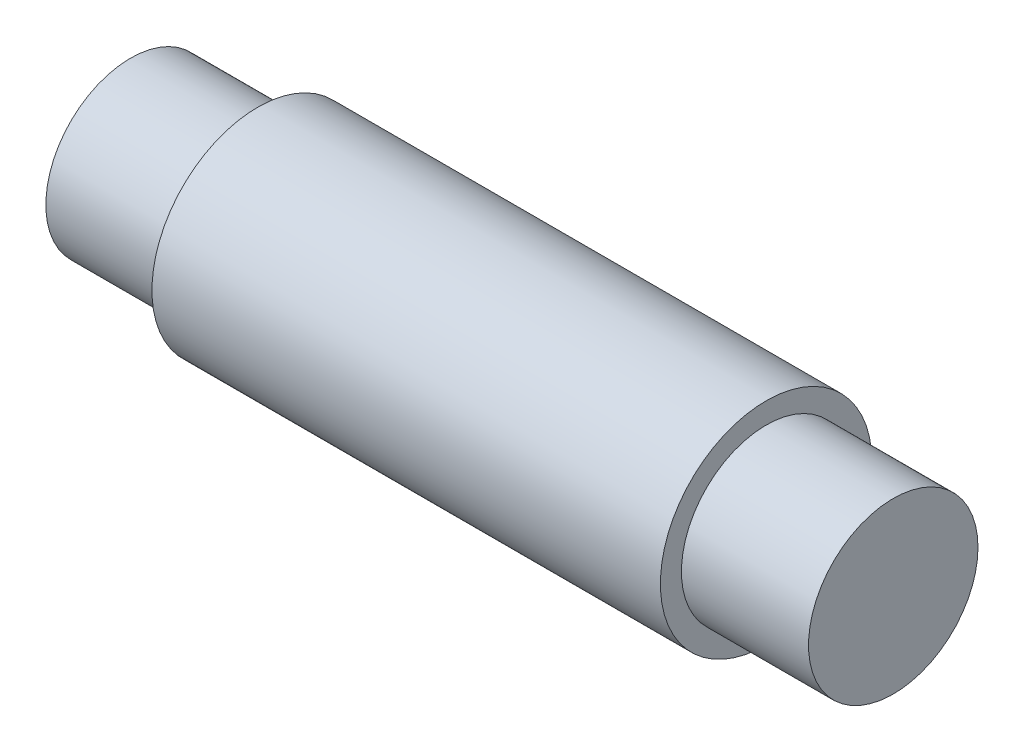
ISO-10303-21;
HEADER;
FILE_DESCRIPTION(('STEP AP214'),'2;1');
FILE_NAME('part.step','',(''),(''),'','','');
FILE_SCHEMA(('AUTOMOTIVE_DESIGN { 1 0 10303 214 1 1 1 1 }'));
ENDSEC;
DATA;
#1=APPLICATION_CONTEXT('core data for automotive mechanical design processes');
#2=APPLICATION_PROTOCOL_DEFINITION('international standard','automotive_design',2000,#1);
#3=PRODUCT_CONTEXT('',#1,'mechanical');
#4=PRODUCT('Part','Part','',(#3));
#5=PRODUCT_RELATED_PRODUCT_CATEGORY('part','',(#4));
#6=PRODUCT_DEFINITION_FORMATION('','',#4);
#7=PRODUCT_DEFINITION_CONTEXT('part definition',#1,'design');
#8=PRODUCT_DEFINITION('design','',#6,#7);
#9=PRODUCT_DEFINITION_SHAPE('','',#8);
#10=(LENGTH_UNIT() NAMED_UNIT(*) SI_UNIT(.MILLI.,.METRE.));
#11=(NAMED_UNIT(*) PLANE_ANGLE_UNIT() SI_UNIT($,.RADIAN.));
#12=(NAMED_UNIT(*) SI_UNIT($,.STERADIAN.) SOLID_ANGLE_UNIT());
#13=UNCERTAINTY_MEASURE_WITH_UNIT(LENGTH_MEASURE(1.E-05),#10,'distance_accuracy_value','');
#14=(GEOMETRIC_REPRESENTATION_CONTEXT(3) GLOBAL_UNCERTAINTY_ASSIGNED_CONTEXT((#13)) GLOBAL_UNIT_ASSIGNED_CONTEXT((#10,
#11,#12)) REPRESENTATION_CONTEXT('',''));
#15=CARTESIAN_POINT('',(0.,0.,0.));
#16=DIRECTION('',(0.,0.,1.));
#17=DIRECTION('',(1.,0.,0.));
#18=AXIS2_PLACEMENT_3D('',#15,#16,#17);
#19=CARTESIAN_POINT('',(-14.2875,0.,0.));
#20=DIRECTION('',(1.,0.,0.));
#21=DIRECTION('',(0.,0.,-1.));
#22=AXIS2_PLACEMENT_3D('',#19,#20,#21);
#23=PLANE('',#22);
#24=CARTESIAN_POINT('',(-14.2875,0.,0.));
#25=DIRECTION('',(1.,0.,0.));
#26=DIRECTION('',(0.,0.,-1.));
#27=AXIS2_PLACEMENT_3D('',#24,#25,#26);
#28=CIRCLE('',#27,3.17499999999999);
#29=CARTESIAN_POINT('',(-14.2875,0.,-3.17499999999999));
#30=VERTEX_POINT('',#29);
#31=EDGE_CURVE('E66',#30,#30,#28,.T.);
#32=ORIENTED_EDGE('',*,*,#31,.F.);
#33=EDGE_LOOP('',(#32));
#34=FACE_BOUND('',#33,.T.);
#35=ADVANCED_FACE('F39',(#34),#23,.F.);
#36=CARTESIAN_POINT('',(14.2875,0.,0.));
#37=DIRECTION('',(1.,0.,0.));
#38=DIRECTION('',(0.,0.,-1.));
#39=AXIS2_PLACEMENT_3D('',#36,#37,#38);
#40=PLANE('',#39);
#41=CARTESIAN_POINT('',(14.2875,0.,0.));
#42=DIRECTION('',(1.,0.,0.));
#43=DIRECTION('',(0.,0.,-1.));
#44=AXIS2_PLACEMENT_3D('',#41,#42,#43);
#45=CIRCLE('',#44,3.17499999999999);
#46=CARTESIAN_POINT('',(14.2875,0.,-3.17499999999999));
#47=VERTEX_POINT('',#46);
#48=EDGE_CURVE('E10',#47,#47,#45,.T.);
#49=ORIENTED_EDGE('',*,*,#48,.T.);
#50=EDGE_LOOP('',(#49));
#51=FACE_BOUND('',#50,.T.);
#52=ADVANCED_FACE('F75',(#51),#40,.T.);
#53=CARTESIAN_POINT('',(9.525,0.,0.));
#54=DIRECTION('',(1.,0.,0.));
#55=DIRECTION('',(0.,0.,-1.));
#56=AXIS2_PLACEMENT_3D('',#53,#54,#55);
#57=CYLINDRICAL_SURFACE('',#56,3.17499999999999);
#58=ORIENTED_EDGE('',*,*,#48,.F.);
#59=EDGE_LOOP('',(#58));
#60=FACE_BOUND('',#59,.T.);
#61=CARTESIAN_POINT('',(9.525,0.,0.));
#62=DIRECTION('',(1.,0.,0.));
#63=DIRECTION('',(0.,0.,-1.));
#64=AXIS2_PLACEMENT_3D('',#61,#62,#63);
#65=CIRCLE('',#64,3.17499999999999);
#66=CARTESIAN_POINT('',(9.525,0.,-3.17499999999999));
#67=VERTEX_POINT('',#66);
#68=EDGE_CURVE('E46',#67,#67,#65,.T.);
#69=ORIENTED_EDGE('',*,*,#68,.T.);
#70=EDGE_LOOP('',(#69));
#71=FACE_BOUND('',#70,.T.);
#72=ADVANCED_FACE('F79',(#60,#71),#57,.T.);
#73=CARTESIAN_POINT('',(9.525,0.,0.));
#74=DIRECTION('',(1.,0.,0.));
#75=DIRECTION('',(0.,0.,-1.));
#76=AXIS2_PLACEMENT_3D('',#73,#74,#75);
#77=PLANE('',#76);
#78=CARTESIAN_POINT('',(9.525,0.,0.));
#79=DIRECTION('',(1.,0.,0.));
#80=DIRECTION('',(0.,0.,-1.));
#81=AXIS2_PLACEMENT_3D('',#78,#79,#80);
#82=CIRCLE('',#81,3.9624);
#83=CARTESIAN_POINT('',(9.525,0.,-3.9624));
#84=VERTEX_POINT('',#83);
#85=EDGE_CURVE('E51',#84,#84,#82,.T.);
#86=ORIENTED_EDGE('',*,*,#85,.T.);
#87=EDGE_LOOP('',(#86));
#88=FACE_BOUND('',#87,.T.);
#89=ORIENTED_EDGE('',*,*,#68,.F.);
#90=EDGE_LOOP('',(#89));
#91=FACE_BOUND('',#90,.T.);
#92=ADVANCED_FACE('F83',(#88,#91),#77,.T.);
#93=CARTESIAN_POINT('',(9.525,0.,0.));
#94=DIRECTION('',(1.,0.,0.));
#95=DIRECTION('',(0.,0.,-1.));
#96=AXIS2_PLACEMENT_3D('',#93,#94,#95);
#97=CYLINDRICAL_SURFACE('',#96,3.9624);
#98=ORIENTED_EDGE('',*,*,#85,.F.);
#99=EDGE_LOOP('',(#98));
#100=FACE_BOUND('',#99,.T.);
#101=CARTESIAN_POINT('',(-9.525,0.,0.));
#102=DIRECTION('',(1.,0.,0.));
#103=DIRECTION('',(0.,0.,-1.));
#104=AXIS2_PLACEMENT_3D('',#101,#102,#103);
#105=CIRCLE('',#104,3.9624);
#106=CARTESIAN_POINT('',(-9.525,0.,-3.9624));
#107=VERTEX_POINT('',#106);
#108=EDGE_CURVE('E56',#107,#107,#105,.T.);
#109=ORIENTED_EDGE('',*,*,#108,.T.);
#110=EDGE_LOOP('',(#109));
#111=FACE_BOUND('',#110,.T.);
#112=ADVANCED_FACE('F89',(#100,#111),#97,.T.);
#113=CARTESIAN_POINT('',(-9.525,0.,0.));
#114=DIRECTION('',(1.,0.,0.));
#115=DIRECTION('',(0.,0.,-1.));
#116=AXIS2_PLACEMENT_3D('',#113,#114,#115);
#117=PLANE('',#116);
#118=ORIENTED_EDGE('',*,*,#108,.F.);
#119=EDGE_LOOP('',(#118));
#120=FACE_BOUND('',#119,.T.);
#121=CARTESIAN_POINT('',(-9.525,0.,0.));
#122=DIRECTION('',(1.,0.,0.));
#123=DIRECTION('',(0.,0.,-1.));
#124=AXIS2_PLACEMENT_3D('',#121,#122,#123);
#125=CIRCLE('',#124,3.17499999999999);
#126=CARTESIAN_POINT('',(-9.525,0.,-3.17499999999999));
#127=VERTEX_POINT('',#126);
#128=EDGE_CURVE('E62',#127,#127,#125,.T.);
#129=ORIENTED_EDGE('',*,*,#128,.T.);
#130=EDGE_LOOP('',(#129));
#131=FACE_BOUND('',#130,.T.);
#132=ADVANCED_FACE('F93',(#120,#131),#117,.F.);
#133=CARTESIAN_POINT('',(9.525,0.,0.));
#134=DIRECTION('',(1.,0.,0.));
#135=DIRECTION('',(0.,0.,-1.));
#136=AXIS2_PLACEMENT_3D('',#133,#134,#135);
#137=CYLINDRICAL_SURFACE('',#136,3.17499999999999);
#138=ORIENTED_EDGE('',*,*,#31,.T.);
#139=EDGE_LOOP('',(#138));
#140=FACE_BOUND('',#139,.T.);
#141=ORIENTED_EDGE('',*,*,#128,.F.);
#142=EDGE_LOOP('',(#141));
#143=FACE_BOUND('',#142,.T.);
#144=ADVANCED_FACE('F71',(#140,#143),#137,.T.);
#145=CLOSED_SHELL('',(#35,#52,#72,#92,#112,#132,#144));
#146=MANIFOLD_SOLID_BREP('B2',#145);
#147=ADVANCED_BREP_SHAPE_REPRESENTATION('',(#18,#146),#14);
#148=SHAPE_DEFINITION_REPRESENTATION(#9,#147);
ENDSEC;
END-ISO-10303-21;
